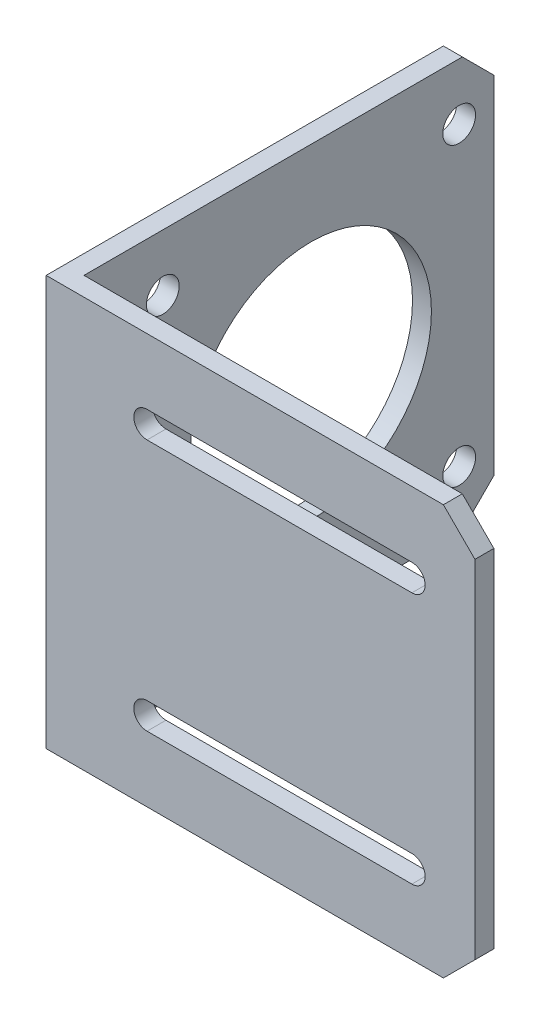
ISO-10303-21;
HEADER;
FILE_DESCRIPTION(('STEP AP214'),'2;1');
FILE_NAME('part.step','',(''),(''),'','','');
FILE_SCHEMA(('AUTOMOTIVE_DESIGN { 1 0 10303 214 1 1 1 1 }'));
ENDSEC;
DATA;
#1=APPLICATION_CONTEXT('core data for automotive mechanical design processes');
#2=APPLICATION_PROTOCOL_DEFINITION('international standard','automotive_design',2000,#1);
#3=PRODUCT_CONTEXT('',#1,'mechanical');
#4=PRODUCT('Part','Part','',(#3));
#5=PRODUCT_RELATED_PRODUCT_CATEGORY('part','',(#4));
#6=PRODUCT_DEFINITION_FORMATION('','',#4);
#7=PRODUCT_DEFINITION_CONTEXT('part definition',#1,'design');
#8=PRODUCT_DEFINITION('design','',#6,#7);
#9=PRODUCT_DEFINITION_SHAPE('','',#8);
#10=(LENGTH_UNIT() NAMED_UNIT(*) SI_UNIT(.MILLI.,.METRE.));
#11=(NAMED_UNIT(*) PLANE_ANGLE_UNIT() SI_UNIT($,.RADIAN.));
#12=(NAMED_UNIT(*) SI_UNIT($,.STERADIAN.) SOLID_ANGLE_UNIT());
#13=UNCERTAINTY_MEASURE_WITH_UNIT(LENGTH_MEASURE(1.E-05),#10,'distance_accuracy_value','');
#14=(GEOMETRIC_REPRESENTATION_CONTEXT(3) GLOBAL_UNCERTAINTY_ASSIGNED_CONTEXT((#13)) GLOBAL_UNIT_ASSIGNED_CONTEXT((#10,
#11,#12)) REPRESENTATION_CONTEXT('',''));
#15=CARTESIAN_POINT('',(0.,0.,0.));
#16=DIRECTION('',(0.,0.,1.));
#17=DIRECTION('',(1.,0.,0.));
#18=AXIS2_PLACEMENT_3D('',#15,#16,#17);
#19=CARTESIAN_POINT('',(0.,65.,0.));
#20=DIRECTION('',(0.,1.,0.));
#21=DIRECTION('',(0.,0.,1.));
#22=AXIS2_PLACEMENT_3D('',#19,#20,#21);
#23=PLANE('',#22);
#24=DIRECTION('',(1.,0.,0.));
#25=VECTOR('',#24,1.);
#26=CARTESIAN_POINT('',(0.,65.,0.));
#27=LINE('',#26,#25);
#28=CARTESIAN_POINT('',(0.,65.,0.));
#29=VERTEX_POINT('',#28);
#30=CARTESIAN_POINT('',(63.,65.,0.));
#31=VERTEX_POINT('',#30);
#32=EDGE_CURVE('E293',#29,#31,#27,.T.);
#33=ORIENTED_EDGE('',*,*,#32,.T.);
#34=DIRECTION('',(0.,0.,-1.));
#35=VECTOR('',#34,1.);
#36=CARTESIAN_POINT('',(63.,65.,-3.));
#37=LINE('',#36,#35);
#38=CARTESIAN_POINT('',(63.,65.,-3.));
#39=VERTEX_POINT('',#38);
#40=EDGE_CURVE('E328',#31,#39,#37,.T.);
#41=ORIENTED_EDGE('',*,*,#40,.T.);
#42=DIRECTION('',(1.,0.,0.));
#43=VECTOR('',#42,1.);
#44=CARTESIAN_POINT('',(0.,65.,-3.));
#45=LINE('',#44,#43);
#46=CARTESIAN_POINT('',(3.,65.,-3.));
#47=VERTEX_POINT('',#46);
#48=EDGE_CURVE('E290',#47,#39,#45,.T.);
#49=ORIENTED_EDGE('',*,*,#48,.F.);
#50=DIRECTION('',(0.,0.,-1.));
#51=VECTOR('',#50,1.);
#52=CARTESIAN_POINT('',(3.,65.,0.));
#53=LINE('',#52,#51);
#54=CARTESIAN_POINT('',(3.,65.,-63.));
#55=VERTEX_POINT('',#54);
#56=EDGE_CURVE('E270',#47,#55,#53,.T.);
#57=ORIENTED_EDGE('',*,*,#56,.T.);
#58=DIRECTION('',(-1.,0.,0.));
#59=VECTOR('',#58,1.);
#60=CARTESIAN_POINT('',(0.,65.,-63.));
#61=LINE('',#60,#59);
#62=CARTESIAN_POINT('',(0.,65.,-63.));
#63=VERTEX_POINT('',#62);
#64=EDGE_CURVE('E326',#55,#63,#61,.T.);
#65=ORIENTED_EDGE('',*,*,#64,.T.);
#66=DIRECTION('',(0.,0.,-1.));
#67=VECTOR('',#66,1.);
#68=CARTESIAN_POINT('',(0.,65.,0.));
#69=LINE('',#68,#67);
#70=EDGE_CURVE('E273',#29,#63,#69,.T.);
#71=ORIENTED_EDGE('',*,*,#70,.F.);
#72=EDGE_LOOP('',(#33,#41,#49,#57,#65,#71));
#73=FACE_BOUND('',#72,.T.);
#74=ADVANCED_FACE('F38',(#73),#23,.T.);
#75=CARTESIAN_POINT('',(0.,65.,-68.));
#76=DIRECTION('',(0.,0.,-1.));
#77=DIRECTION('',(-1.,0.,0.));
#78=AXIS2_PLACEMENT_3D('',#75,#76,#77);
#79=PLANE('',#78);
#80=DIRECTION('',(0.,-1.,0.));
#81=VECTOR('',#80,1.);
#82=CARTESIAN_POINT('',(0.,65.,-68.));
#83=LINE('',#82,#81);
#84=CARTESIAN_POINT('',(0.,60.,-68.));
#85=VERTEX_POINT('',#84);
#86=CARTESIAN_POINT('',(0.,5.00000000000002,-68.));
#87=VERTEX_POINT('',#86);
#88=EDGE_CURVE('E277',#85,#87,#83,.T.);
#89=ORIENTED_EDGE('',*,*,#88,.F.);
#90=DIRECTION('',(1.,0.,0.));
#91=VECTOR('',#90,1.);
#92=CARTESIAN_POINT('',(0.,60.,-68.));
#93=LINE('',#92,#91);
#94=CARTESIAN_POINT('',(3.,60.,-68.));
#95=VERTEX_POINT('',#94);
#96=EDGE_CURVE('E333',#85,#95,#93,.T.);
#97=ORIENTED_EDGE('',*,*,#96,.T.);
#98=DIRECTION('',(0.,-1.,0.));
#99=VECTOR('',#98,1.);
#100=CARTESIAN_POINT('',(3.,65.,-68.));
#101=LINE('',#100,#99);
#102=CARTESIAN_POINT('',(3.,5.00000000000002,-68.));
#103=VERTEX_POINT('',#102);
#104=EDGE_CURVE('E285',#95,#103,#101,.T.);
#105=ORIENTED_EDGE('',*,*,#104,.T.);
#106=DIRECTION('',(-1.,0.,0.));
#107=VECTOR('',#106,1.);
#108=CARTESIAN_POINT('',(0.,5.00000000000002,-68.));
#109=LINE('',#108,#107);
#110=EDGE_CURVE('E331',#103,#87,#109,.T.);
#111=ORIENTED_EDGE('',*,*,#110,.T.);
#112=EDGE_LOOP('',(#89,#97,#105,#111));
#113=FACE_BOUND('',#112,.T.);
#114=ADVANCED_FACE('F349',(#113),#79,.T.);
#115=CARTESIAN_POINT('',(0.,0.,0.));
#116=DIRECTION('',(0.,1.,0.));
#117=DIRECTION('',(0.,0.,1.));
#118=AXIS2_PLACEMENT_3D('',#115,#116,#117);
#119=PLANE('',#118);
#120=DIRECTION('',(1.,0.,0.));
#121=VECTOR('',#120,1.);
#122=CARTESIAN_POINT('',(0.,0.,-3.));
#123=LINE('',#122,#121);
#124=CARTESIAN_POINT('',(3.,0.,-3.));
#125=VERTEX_POINT('',#124);
#126=CARTESIAN_POINT('',(63.,0.,-3.));
#127=VERTEX_POINT('',#126);
#128=EDGE_CURVE('E269',#125,#127,#123,.T.);
#129=ORIENTED_EDGE('',*,*,#128,.T.);
#130=DIRECTION('',(0.,0.,1.));
#131=VECTOR('',#130,1.);
#132=CARTESIAN_POINT('',(63.,0.,0.));
#133=LINE('',#132,#131);
#134=CARTESIAN_POINT('',(63.,0.,0.));
#135=VERTEX_POINT('',#134);
#136=EDGE_CURVE('E320',#127,#135,#133,.T.);
#137=ORIENTED_EDGE('',*,*,#136,.T.);
#138=DIRECTION('',(1.,0.,0.));
#139=VECTOR('',#138,1.);
#140=CARTESIAN_POINT('',(0.,0.,0.));
#141=LINE('',#140,#139);
#142=CARTESIAN_POINT('',(0.,0.,0.));
#143=VERTEX_POINT('',#142);
#144=EDGE_CURVE('E294',#143,#135,#141,.T.);
#145=ORIENTED_EDGE('',*,*,#144,.F.);
#146=DIRECTION('',(0.,0.,-1.));
#147=VECTOR('',#146,1.);
#148=CARTESIAN_POINT('',(0.,0.,0.));
#149=LINE('',#148,#147);
#150=CARTESIAN_POINT('',(0.,0.,-63.));
#151=VERTEX_POINT('',#150);
#152=EDGE_CURVE('E274',#143,#151,#149,.T.);
#153=ORIENTED_EDGE('',*,*,#152,.T.);
#154=DIRECTION('',(1.,0.,0.));
#155=VECTOR('',#154,1.);
#156=CARTESIAN_POINT('',(3.,0.,-63.));
#157=LINE('',#156,#155);
#158=CARTESIAN_POINT('',(3.,0.,-63.));
#159=VERTEX_POINT('',#158);
#160=EDGE_CURVE('E317',#151,#159,#157,.T.);
#161=ORIENTED_EDGE('',*,*,#160,.T.);
#162=DIRECTION('',(0.,0.,-1.));
#163=VECTOR('',#162,1.);
#164=CARTESIAN_POINT('',(3.,0.,0.));
#165=LINE('',#164,#163);
#166=EDGE_CURVE('E278',#125,#159,#165,.T.);
#167=ORIENTED_EDGE('',*,*,#166,.F.);
#168=EDGE_LOOP('',(#129,#137,#145,#153,#161,#167));
#169=FACE_BOUND('',#168,.T.);
#170=ADVANCED_FACE('F346',(#169),#119,.F.);
#171=CARTESIAN_POINT('',(3.,65.,0.));
#172=DIRECTION('',(-1.,0.,0.));
#173=DIRECTION('',(0.,0.,1.));
#174=AXIS2_PLACEMENT_3D('',#171,#172,#173);
#175=PLANE('',#174);
#176=CARTESIAN_POINT('',(3.,8.99999999999999,-15.5));
#177=DIRECTION('',(-1.,0.,0.));
#178=DIRECTION('',(0.,0.,1.));
#179=AXIS2_PLACEMENT_3D('',#176,#177,#178);
#180=CIRCLE('',#179,2.6);
#181=CARTESIAN_POINT('',(3.,8.99999999999999,-12.9));
#182=VERTEX_POINT('',#181);
#183=EDGE_CURVE('E266',#182,#182,#180,.T.);
#184=ORIENTED_EDGE('',*,*,#183,.T.);
#185=EDGE_LOOP('',(#184));
#186=FACE_BOUND('',#185,.T.);
#187=CARTESIAN_POINT('',(3.,56.,-15.5));
#188=DIRECTION('',(-1.,0.,0.));
#189=DIRECTION('',(0.,0.,1.));
#190=AXIS2_PLACEMENT_3D('',#187,#188,#189);
#191=CIRCLE('',#190,2.6);
#192=CARTESIAN_POINT('',(3.,56.,-12.9));
#193=VERTEX_POINT('',#192);
#194=EDGE_CURVE('E263',#193,#193,#191,.T.);
#195=ORIENTED_EDGE('',*,*,#194,.T.);
#196=EDGE_LOOP('',(#195));
#197=FACE_BOUND('',#196,.T.);
#198=CARTESIAN_POINT('',(3.,56.,-62.5));
#199=DIRECTION('',(-1.,0.,0.));
#200=DIRECTION('',(0.,0.,1.));
#201=AXIS2_PLACEMENT_3D('',#198,#199,#200);
#202=CIRCLE('',#201,2.6);
#203=CARTESIAN_POINT('',(3.,56.,-59.9));
#204=VERTEX_POINT('',#203);
#205=EDGE_CURVE('E260',#204,#204,#202,.T.);
#206=ORIENTED_EDGE('',*,*,#205,.T.);
#207=EDGE_LOOP('',(#206));
#208=FACE_BOUND('',#207,.T.);
#209=CARTESIAN_POINT('',(3.,8.99999999999998,-62.5));
#210=DIRECTION('',(-1.,0.,0.));
#211=DIRECTION('',(0.,0.,1.));
#212=AXIS2_PLACEMENT_3D('',#209,#210,#211);
#213=CIRCLE('',#212,2.6);
#214=CARTESIAN_POINT('',(3.,8.99999999999998,-59.9));
#215=VERTEX_POINT('',#214);
#216=EDGE_CURVE('E257',#215,#215,#213,.T.);
#217=ORIENTED_EDGE('',*,*,#216,.T.);
#218=EDGE_LOOP('',(#217));
#219=FACE_BOUND('',#218,.T.);
#220=CARTESIAN_POINT('',(3.,32.5,-39.));
#221=DIRECTION('',(-1.,0.,0.));
#222=DIRECTION('',(0.,0.,1.));
#223=AXIS2_PLACEMENT_3D('',#220,#221,#222);
#224=CIRCLE('',#223,19.1);
#225=CARTESIAN_POINT('',(3.,32.5,-19.9));
#226=VERTEX_POINT('',#225);
#227=EDGE_CURVE('E254',#226,#226,#224,.T.);
#228=ORIENTED_EDGE('',*,*,#227,.T.);
#229=EDGE_LOOP('',(#228));
#230=FACE_BOUND('',#229,.T.);
#231=ORIENTED_EDGE('',*,*,#104,.F.);
#232=DIRECTION('',(0.,-0.707106781186547,-0.707106781186549));
#233=VECTOR('',#232,1.);
#234=CARTESIAN_POINT('',(3.,60.,-68.));
#235=LINE('',#234,#233);
#236=EDGE_CURVE('E61',#95,#55,#235,.F.);
#237=ORIENTED_EDGE('',*,*,#236,.T.);
#238=ORIENTED_EDGE('',*,*,#56,.F.);
#239=DIRECTION('',(0.,-1.,0.));
#240=VECTOR('',#239,1.);
#241=CARTESIAN_POINT('',(3.,65.,-3.));
#242=LINE('',#241,#240);
#243=EDGE_CURVE('E287',#47,#125,#242,.T.);
#244=ORIENTED_EDGE('',*,*,#243,.T.);
#245=ORIENTED_EDGE('',*,*,#166,.T.);
#246=DIRECTION('',(0.,0.707106781186549,-0.707106781186547));
#247=VECTOR('',#246,1.);
#248=CARTESIAN_POINT('',(3.,0.,-63.));
#249=LINE('',#248,#247);
#250=EDGE_CURVE('E53',#159,#103,#249,.T.);
#251=ORIENTED_EDGE('',*,*,#250,.T.);
#252=EDGE_LOOP('',(#231,#237,#238,#244,#245,#251));
#253=FACE_BOUND('',#252,.T.);
#254=ADVANCED_FACE('F350',(#186,#197,#208,#219,#230,#253),#175,.F.);
#255=CARTESIAN_POINT('',(0.,65.,0.));
#256=DIRECTION('',(-1.,0.,0.));
#257=DIRECTION('',(0.,0.,1.));
#258=AXIS2_PLACEMENT_3D('',#255,#256,#257);
#259=PLANE('',#258);
#260=CARTESIAN_POINT('',(0.,8.99999999999999,-15.5));
#261=DIRECTION('',(-1.,0.,0.));
#262=DIRECTION('',(0.,0.,1.));
#263=AXIS2_PLACEMENT_3D('',#260,#261,#262);
#264=CIRCLE('',#263,2.6);
#265=CARTESIAN_POINT('',(0.,8.99999999999999,-12.9));
#266=VERTEX_POINT('',#265);
#267=EDGE_CURVE('E233',#266,#266,#264,.T.);
#268=ORIENTED_EDGE('',*,*,#267,.F.);
#269=EDGE_LOOP('',(#268));
#270=FACE_BOUND('',#269,.T.);
#271=CARTESIAN_POINT('',(0.,56.,-15.5));
#272=DIRECTION('',(-1.,0.,0.));
#273=DIRECTION('',(0.,0.,1.));
#274=AXIS2_PLACEMENT_3D('',#271,#272,#273);
#275=CIRCLE('',#274,2.6);
#276=CARTESIAN_POINT('',(0.,56.,-12.9));
#277=VERTEX_POINT('',#276);
#278=EDGE_CURVE('E247',#277,#277,#275,.T.);
#279=ORIENTED_EDGE('',*,*,#278,.F.);
#280=EDGE_LOOP('',(#279));
#281=FACE_BOUND('',#280,.T.);
#282=CARTESIAN_POINT('',(0.,56.,-62.5));
#283=DIRECTION('',(-1.,0.,0.));
#284=DIRECTION('',(0.,0.,1.));
#285=AXIS2_PLACEMENT_3D('',#282,#283,#284);
#286=CIRCLE('',#285,2.6);
#287=CARTESIAN_POINT('',(0.,56.,-59.9));
#288=VERTEX_POINT('',#287);
#289=EDGE_CURVE('E244',#288,#288,#286,.T.);
#290=ORIENTED_EDGE('',*,*,#289,.F.);
#291=EDGE_LOOP('',(#290));
#292=FACE_BOUND('',#291,.T.);
#293=CARTESIAN_POINT('',(0.,8.99999999999998,-62.5));
#294=DIRECTION('',(-1.,0.,0.));
#295=DIRECTION('',(0.,0.,1.));
#296=AXIS2_PLACEMENT_3D('',#293,#294,#295);
#297=CIRCLE('',#296,2.6);
#298=CARTESIAN_POINT('',(0.,8.99999999999998,-59.9));
#299=VERTEX_POINT('',#298);
#300=EDGE_CURVE('E240',#299,#299,#297,.T.);
#301=ORIENTED_EDGE('',*,*,#300,.F.);
#302=EDGE_LOOP('',(#301));
#303=FACE_BOUND('',#302,.T.);
#304=CARTESIAN_POINT('',(0.,32.5,-39.));
#305=DIRECTION('',(-1.,0.,0.));
#306=DIRECTION('',(0.,0.,1.));
#307=AXIS2_PLACEMENT_3D('',#304,#305,#306);
#308=CIRCLE('',#307,19.1);
#309=CARTESIAN_POINT('',(0.,32.5,-19.9));
#310=VERTEX_POINT('',#309);
#311=EDGE_CURVE('E243',#310,#310,#308,.T.);
#312=ORIENTED_EDGE('',*,*,#311,.F.);
#313=EDGE_LOOP('',(#312));
#314=FACE_BOUND('',#313,.T.);
#315=ORIENTED_EDGE('',*,*,#70,.T.);
#316=DIRECTION('',(0.,0.707106781186547,0.707106781186549));
#317=VECTOR('',#316,1.);
#318=CARTESIAN_POINT('',(0.,96.5,-31.4999999999999));
#319=LINE('',#318,#317);
#320=EDGE_CURVE('E11',#63,#85,#319,.F.);
#321=ORIENTED_EDGE('',*,*,#320,.T.);
#322=ORIENTED_EDGE('',*,*,#88,.T.);
#323=DIRECTION('',(0.,-0.707106781186549,0.707106781186547));
#324=VECTOR('',#323,1.);
#325=CARTESIAN_POINT('',(0.,1.00000000000008,-64.0000000000001));
#326=LINE('',#325,#324);
#327=EDGE_CURVE('E46',#87,#151,#326,.T.);
#328=ORIENTED_EDGE('',*,*,#327,.T.);
#329=ORIENTED_EDGE('',*,*,#152,.F.);
#330=DIRECTION('',(0.,-1.,0.));
#331=VECTOR('',#330,1.);
#332=CARTESIAN_POINT('',(0.,65.,0.));
#333=LINE('',#332,#331);
#334=EDGE_CURVE('E280',#29,#143,#333,.T.);
#335=ORIENTED_EDGE('',*,*,#334,.F.);
#336=EDGE_LOOP('',(#315,#321,#322,#328,#329,#335));
#337=FACE_BOUND('',#336,.T.);
#338=ADVANCED_FACE('F338',(#270,#281,#292,#303,#314,#337),#259,.T.);
#339=CARTESIAN_POINT('',(0.,65.,0.));
#340=DIRECTION('',(0.,0.,-1.));
#341=DIRECTION('',(-1.,0.,0.));
#342=AXIS2_PLACEMENT_3D('',#339,#340,#341);
#343=PLANE('',#342);
#344=DIRECTION('',(1.,0.,0.));
#345=VECTOR('',#344,1.);
#346=CARTESIAN_POINT('',(0.,50.4,0.));
#347=LINE('',#346,#345);
#348=CARTESIAN_POINT('',(16.,50.4,0.));
#349=VERTEX_POINT('',#348);
#350=CARTESIAN_POINT('',(58.,50.4,0.));
#351=VERTEX_POINT('',#350);
#352=EDGE_CURVE('E176',#349,#351,#347,.T.);
#353=ORIENTED_EDGE('',*,*,#352,.F.);
#354=CARTESIAN_POINT('',(16.,52.5,0.));
#355=DIRECTION('',(0.,0.,1.));
#356=DIRECTION('',(-1.,0.,0.));
#357=AXIS2_PLACEMENT_3D('',#354,#355,#356);
#358=CIRCLE('',#357,2.1);
#359=CARTESIAN_POINT('',(16.,54.6,0.));
#360=VERTEX_POINT('',#359);
#361=EDGE_CURVE('E164',#360,#349,#358,.T.);
#362=ORIENTED_EDGE('',*,*,#361,.F.);
#363=DIRECTION('',(-1.,0.,0.));
#364=VECTOR('',#363,1.);
#365=CARTESIAN_POINT('',(0.,54.6,0.));
#366=LINE('',#365,#364);
#367=CARTESIAN_POINT('',(58.,54.6,0.));
#368=VERTEX_POINT('',#367);
#369=EDGE_CURVE('E175',#368,#360,#366,.T.);
#370=ORIENTED_EDGE('',*,*,#369,.F.);
#371=CARTESIAN_POINT('',(58.,52.5,0.));
#372=DIRECTION('',(0.,0.,1.));
#373=DIRECTION('',(-1.,0.,0.));
#374=AXIS2_PLACEMENT_3D('',#371,#372,#373);
#375=CIRCLE('',#374,2.1);
#376=EDGE_CURVE('E184',#351,#368,#375,.T.);
#377=ORIENTED_EDGE('',*,*,#376,.F.);
#378=EDGE_LOOP('',(#353,#362,#370,#377));
#379=FACE_BOUND('',#378,.T.);
#380=CARTESIAN_POINT('',(16.,12.5,0.));
#381=DIRECTION('',(0.,0.,-1.));
#382=DIRECTION('',(-1.,0.,0.));
#383=AXIS2_PLACEMENT_3D('',#380,#381,#382);
#384=CIRCLE('',#383,2.1);
#385=CARTESIAN_POINT('',(16.,10.4,0.));
#386=VERTEX_POINT('',#385);
#387=CARTESIAN_POINT('',(16.,14.6,0.));
#388=VERTEX_POINT('',#387);
#389=EDGE_CURVE('E218',#386,#388,#384,.T.);
#390=ORIENTED_EDGE('',*,*,#389,.T.);
#391=DIRECTION('',(1.,0.,0.));
#392=VECTOR('',#391,1.);
#393=CARTESIAN_POINT('',(0.,14.6,0.));
#394=LINE('',#393,#392);
#395=CARTESIAN_POINT('',(58.,14.6,0.));
#396=VERTEX_POINT('',#395);
#397=EDGE_CURVE('E208',#388,#396,#394,.T.);
#398=ORIENTED_EDGE('',*,*,#397,.T.);
#399=CARTESIAN_POINT('',(58.,12.5,0.));
#400=DIRECTION('',(0.,0.,-1.));
#401=DIRECTION('',(-1.,0.,0.));
#402=AXIS2_PLACEMENT_3D('',#399,#400,#401);
#403=CIRCLE('',#402,2.1);
#404=CARTESIAN_POINT('',(58.,10.4,0.));
#405=VERTEX_POINT('',#404);
#406=EDGE_CURVE('E211',#396,#405,#403,.T.);
#407=ORIENTED_EDGE('',*,*,#406,.T.);
#408=DIRECTION('',(-1.,0.,0.));
#409=VECTOR('',#408,1.);
#410=CARTESIAN_POINT('',(0.,10.4,0.));
#411=LINE('',#410,#409);
#412=EDGE_CURVE('E215',#405,#386,#411,.T.);
#413=ORIENTED_EDGE('',*,*,#412,.T.);
#414=EDGE_LOOP('',(#390,#398,#407,#413));
#415=FACE_BOUND('',#414,.T.);
#416=ORIENTED_EDGE('',*,*,#144,.T.);
#417=DIRECTION('',(-0.707106781186548,-0.707106781186548,0.));
#418=VECTOR('',#417,1.);
#419=CARTESIAN_POINT('',(68.,5.,0.));
#420=LINE('',#419,#418);
#421=CARTESIAN_POINT('',(68.,5.,0.));
#422=VERTEX_POINT('',#421);
#423=EDGE_CURVE('E324',#135,#422,#420,.F.);
#424=ORIENTED_EDGE('',*,*,#423,.T.);
#425=DIRECTION('',(0.,-1.,0.));
#426=VECTOR('',#425,1.);
#427=CARTESIAN_POINT('',(68.,65.,0.));
#428=LINE('',#427,#426);
#429=CARTESIAN_POINT('',(68.,60.,0.));
#430=VERTEX_POINT('',#429);
#431=EDGE_CURVE('E304',#430,#422,#428,.T.);
#432=ORIENTED_EDGE('',*,*,#431,.F.);
#433=DIRECTION('',(-0.707106781186547,0.707106781186548,0.));
#434=VECTOR('',#433,1.);
#435=CARTESIAN_POINT('',(63.,65.,0.));
#436=LINE('',#435,#434);
#437=EDGE_CURVE('E322',#430,#31,#436,.T.);
#438=ORIENTED_EDGE('',*,*,#437,.T.);
#439=ORIENTED_EDGE('',*,*,#32,.F.);
#440=ORIENTED_EDGE('',*,*,#334,.T.);
#441=EDGE_LOOP('',(#416,#424,#432,#438,#439,#440));
#442=FACE_BOUND('',#441,.T.);
#443=ADVANCED_FACE('F187',(#379,#415,#442),#343,.F.);
#444=CARTESIAN_POINT('',(68.,65.,0.));
#445=DIRECTION('',(-1.,0.,0.));
#446=DIRECTION('',(0.,0.,1.));
#447=AXIS2_PLACEMENT_3D('',#444,#445,#446);
#448=PLANE('',#447);
#449=ORIENTED_EDGE('',*,*,#431,.T.);
#450=DIRECTION('',(0.,0.,-1.));
#451=VECTOR('',#450,1.);
#452=CARTESIAN_POINT('',(68.,5.,0.));
#453=LINE('',#452,#451);
#454=CARTESIAN_POINT('',(68.,5.,-3.));
#455=VERTEX_POINT('',#454);
#456=EDGE_CURVE('E310',#422,#455,#453,.T.);
#457=ORIENTED_EDGE('',*,*,#456,.T.);
#458=DIRECTION('',(0.,-1.,0.));
#459=VECTOR('',#458,1.);
#460=CARTESIAN_POINT('',(68.,65.,-3.));
#461=LINE('',#460,#459);
#462=CARTESIAN_POINT('',(68.,60.,-3.));
#463=VERTEX_POINT('',#462);
#464=EDGE_CURVE('E297',#463,#455,#461,.T.);
#465=ORIENTED_EDGE('',*,*,#464,.F.);
#466=DIRECTION('',(0.,0.,1.));
#467=VECTOR('',#466,1.);
#468=CARTESIAN_POINT('',(68.,60.,0.));
#469=LINE('',#468,#467);
#470=EDGE_CURVE('E289',#463,#430,#469,.T.);
#471=ORIENTED_EDGE('',*,*,#470,.T.);
#472=EDGE_LOOP('',(#449,#457,#465,#471));
#473=FACE_BOUND('',#472,.T.);
#474=ADVANCED_FACE('F367',(#473),#448,.F.);
#475=CARTESIAN_POINT('',(0.,65.,-3.));
#476=DIRECTION('',(0.,0.,-1.));
#477=DIRECTION('',(-1.,0.,0.));
#478=AXIS2_PLACEMENT_3D('',#475,#476,#477);
#479=PLANE('',#478);
#480=CARTESIAN_POINT('',(16.,52.5,-3.));
#481=DIRECTION('',(0.,0.,1.));
#482=DIRECTION('',(-1.,0.,0.));
#483=AXIS2_PLACEMENT_3D('',#480,#481,#482);
#484=CIRCLE('',#483,2.1);
#485=CARTESIAN_POINT('',(16.,54.6,-3.));
#486=VERTEX_POINT('',#485);
#487=CARTESIAN_POINT('',(16.,50.4,-3.));
#488=VERTEX_POINT('',#487);
#489=EDGE_CURVE('E198',#486,#488,#484,.T.);
#490=ORIENTED_EDGE('',*,*,#489,.T.);
#491=DIRECTION('',(1.,0.,0.));
#492=VECTOR('',#491,1.);
#493=CARTESIAN_POINT('',(0.,50.4,-3.));
#494=LINE('',#493,#492);
#495=CARTESIAN_POINT('',(58.,50.4,-3.));
#496=VERTEX_POINT('',#495);
#497=EDGE_CURVE('E183',#488,#496,#494,.T.);
#498=ORIENTED_EDGE('',*,*,#497,.T.);
#499=CARTESIAN_POINT('',(58.,52.5,-3.));
#500=DIRECTION('',(0.,0.,1.));
#501=DIRECTION('',(-1.,0.,0.));
#502=AXIS2_PLACEMENT_3D('',#499,#500,#501);
#503=CIRCLE('',#502,2.1);
#504=CARTESIAN_POINT('',(58.,54.6,-3.));
#505=VERTEX_POINT('',#504);
#506=EDGE_CURVE('E189',#496,#505,#503,.T.);
#507=ORIENTED_EDGE('',*,*,#506,.T.);
#508=DIRECTION('',(-1.,0.,0.));
#509=VECTOR('',#508,1.);
#510=CARTESIAN_POINT('',(0.,54.6,-3.));
#511=LINE('',#510,#509);
#512=EDGE_CURVE('E192',#505,#486,#511,.T.);
#513=ORIENTED_EDGE('',*,*,#512,.T.);
#514=EDGE_LOOP('',(#490,#498,#507,#513));
#515=FACE_BOUND('',#514,.T.);
#516=DIRECTION('',(1.,0.,0.));
#517=VECTOR('',#516,1.);
#518=CARTESIAN_POINT('',(0.,14.6,-3.));
#519=LINE('',#518,#517);
#520=CARTESIAN_POINT('',(16.,14.6,-3.));
#521=VERTEX_POINT('',#520);
#522=CARTESIAN_POINT('',(58.,14.6,-3.));
#523=VERTEX_POINT('',#522);
#524=EDGE_CURVE('E204',#521,#523,#519,.T.);
#525=ORIENTED_EDGE('',*,*,#524,.F.);
#526=CARTESIAN_POINT('',(16.,12.5,-3.));
#527=DIRECTION('',(0.,0.,-1.));
#528=DIRECTION('',(-1.,0.,0.));
#529=AXIS2_PLACEMENT_3D('',#526,#527,#528);
#530=CIRCLE('',#529,2.1);
#531=CARTESIAN_POINT('',(16.,10.4,-3.));
#532=VERTEX_POINT('',#531);
#533=EDGE_CURVE('E212',#532,#521,#530,.T.);
#534=ORIENTED_EDGE('',*,*,#533,.F.);
#535=DIRECTION('',(-1.,0.,0.));
#536=VECTOR('',#535,1.);
#537=CARTESIAN_POINT('',(0.,10.4,-3.));
#538=LINE('',#537,#536);
#539=CARTESIAN_POINT('',(58.,10.4,-3.));
#540=VERTEX_POINT('',#539);
#541=EDGE_CURVE('E226',#540,#532,#538,.T.);
#542=ORIENTED_EDGE('',*,*,#541,.F.);
#543=CARTESIAN_POINT('',(58.,12.5,-3.));
#544=DIRECTION('',(0.,0.,-1.));
#545=DIRECTION('',(-1.,0.,0.));
#546=AXIS2_PLACEMENT_3D('',#543,#544,#545);
#547=CIRCLE('',#546,2.1);
#548=EDGE_CURVE('E223',#523,#540,#547,.T.);
#549=ORIENTED_EDGE('',*,*,#548,.F.);
#550=EDGE_LOOP('',(#525,#534,#542,#549));
#551=FACE_BOUND('',#550,.T.);
#552=ORIENTED_EDGE('',*,*,#464,.T.);
#553=DIRECTION('',(0.707106781186548,0.707106781186548,0.));
#554=VECTOR('',#553,1.);
#555=CARTESIAN_POINT('',(64.,1.00000000000001,-3.));
#556=LINE('',#555,#554);
#557=EDGE_CURVE('E315',#455,#127,#556,.F.);
#558=ORIENTED_EDGE('',*,*,#557,.T.);
#559=ORIENTED_EDGE('',*,*,#128,.F.);
#560=ORIENTED_EDGE('',*,*,#243,.F.);
#561=ORIENTED_EDGE('',*,*,#48,.T.);
#562=DIRECTION('',(0.707106781186547,-0.707106781186548,0.));
#563=VECTOR('',#562,1.);
#564=CARTESIAN_POINT('',(31.5,96.5,-3.));
#565=LINE('',#564,#563);
#566=EDGE_CURVE('E313',#39,#463,#565,.T.);
#567=ORIENTED_EDGE('',*,*,#566,.T.);
#568=EDGE_LOOP('',(#552,#558,#559,#560,#561,#567));
#569=FACE_BOUND('',#568,.T.);
#570=ADVANCED_FACE('F365',(#515,#551,#569),#479,.T.);
#571=CARTESIAN_POINT('',(68.,32.5,-39.));
#572=DIRECTION('',(-1.,0.,0.));
#573=DIRECTION('',(0.,0.,1.));
#574=AXIS2_PLACEMENT_3D('',#571,#572,#573);
#575=CYLINDRICAL_SURFACE('',#574,19.1);
#576=ORIENTED_EDGE('',*,*,#311,.T.);
#577=EDGE_LOOP('',(#576));
#578=FACE_BOUND('',#577,.T.);
#579=ORIENTED_EDGE('',*,*,#227,.F.);
#580=EDGE_LOOP('',(#579));
#581=FACE_BOUND('',#580,.T.);
#582=ADVANCED_FACE('F382',(#578,#581),#575,.F.);
#583=CARTESIAN_POINT('',(68.,8.99999999999998,-62.5));
#584=DIRECTION('',(-1.,0.,0.));
#585=DIRECTION('',(0.,0.,1.));
#586=AXIS2_PLACEMENT_3D('',#583,#584,#585);
#587=CYLINDRICAL_SURFACE('',#586,2.6);
#588=ORIENTED_EDGE('',*,*,#300,.T.);
#589=EDGE_LOOP('',(#588));
#590=FACE_BOUND('',#589,.T.);
#591=ORIENTED_EDGE('',*,*,#216,.F.);
#592=EDGE_LOOP('',(#591));
#593=FACE_BOUND('',#592,.T.);
#594=ADVANCED_FACE('F414',(#590,#593),#587,.F.);
#595=CARTESIAN_POINT('',(68.,56.,-62.5));
#596=DIRECTION('',(-1.,0.,0.));
#597=DIRECTION('',(0.,0.,1.));
#598=AXIS2_PLACEMENT_3D('',#595,#596,#597);
#599=CYLINDRICAL_SURFACE('',#598,2.6);
#600=ORIENTED_EDGE('',*,*,#289,.T.);
#601=EDGE_LOOP('',(#600));
#602=FACE_BOUND('',#601,.T.);
#603=ORIENTED_EDGE('',*,*,#205,.F.);
#604=EDGE_LOOP('',(#603));
#605=FACE_BOUND('',#604,.T.);
#606=ADVANCED_FACE('F419',(#602,#605),#599,.F.);
#607=CARTESIAN_POINT('',(68.,56.,-15.5));
#608=DIRECTION('',(-1.,0.,0.));
#609=DIRECTION('',(0.,0.,1.));
#610=AXIS2_PLACEMENT_3D('',#607,#608,#609);
#611=CYLINDRICAL_SURFACE('',#610,2.6);
#612=ORIENTED_EDGE('',*,*,#278,.T.);
#613=EDGE_LOOP('',(#612));
#614=FACE_BOUND('',#613,.T.);
#615=ORIENTED_EDGE('',*,*,#194,.F.);
#616=EDGE_LOOP('',(#615));
#617=FACE_BOUND('',#616,.T.);
#618=ADVANCED_FACE('F427',(#614,#617),#611,.F.);
#619=CARTESIAN_POINT('',(68.,8.99999999999999,-15.5));
#620=DIRECTION('',(-1.,0.,0.));
#621=DIRECTION('',(0.,0.,1.));
#622=AXIS2_PLACEMENT_3D('',#619,#620,#621);
#623=CYLINDRICAL_SURFACE('',#622,2.6);
#624=ORIENTED_EDGE('',*,*,#267,.T.);
#625=EDGE_LOOP('',(#624));
#626=FACE_BOUND('',#625,.T.);
#627=ORIENTED_EDGE('',*,*,#183,.F.);
#628=EDGE_LOOP('',(#627));
#629=FACE_BOUND('',#628,.T.);
#630=ADVANCED_FACE('F436',(#626,#629),#623,.F.);
#631=CARTESIAN_POINT('',(0.,14.6,0.));
#632=DIRECTION('',(0.,1.,0.));
#633=DIRECTION('',(-1.,0.,0.));
#634=AXIS2_PLACEMENT_3D('',#631,#632,#633);
#635=PLANE('',#634);
#636=ORIENTED_EDGE('',*,*,#524,.T.);
#637=DIRECTION('',(0.,0.,-1.));
#638=VECTOR('',#637,1.);
#639=CARTESIAN_POINT('',(58.,14.6,0.));
#640=LINE('',#639,#638);
#641=EDGE_CURVE('E221',#396,#523,#640,.T.);
#642=ORIENTED_EDGE('',*,*,#641,.F.);
#643=ORIENTED_EDGE('',*,*,#397,.F.);
#644=DIRECTION('',(0.,0.,-1.));
#645=VECTOR('',#644,1.);
#646=CARTESIAN_POINT('',(16.,14.6,0.));
#647=LINE('',#646,#645);
#648=EDGE_CURVE('E231',#388,#521,#647,.T.);
#649=ORIENTED_EDGE('',*,*,#648,.T.);
#650=EDGE_LOOP('',(#636,#642,#643,#649));
#651=FACE_BOUND('',#650,.T.);
#652=ADVANCED_FACE('F432',(#651),#635,.F.);
#653=CARTESIAN_POINT('',(16.,12.5,0.));
#654=DIRECTION('',(0.,0.,-1.));
#655=DIRECTION('',(-1.,0.,0.));
#656=AXIS2_PLACEMENT_3D('',#653,#654,#655);
#657=CYLINDRICAL_SURFACE('',#656,2.1);
#658=ORIENTED_EDGE('',*,*,#533,.T.);
#659=ORIENTED_EDGE('',*,*,#648,.F.);
#660=ORIENTED_EDGE('',*,*,#389,.F.);
#661=DIRECTION('',(0.,0.,-1.));
#662=VECTOR('',#661,1.);
#663=CARTESIAN_POINT('',(16.,10.4,0.));
#664=LINE('',#663,#662);
#665=EDGE_CURVE('E234',#386,#532,#664,.T.);
#666=ORIENTED_EDGE('',*,*,#665,.T.);
#667=EDGE_LOOP('',(#658,#659,#660,#666));
#668=FACE_BOUND('',#667,.T.);
#669=ADVANCED_FACE('F443',(#668),#657,.F.);
#670=CARTESIAN_POINT('',(0.,10.4,0.));
#671=DIRECTION('',(0.,-1.,0.));
#672=DIRECTION('',(0.,0.,-1.));
#673=AXIS2_PLACEMENT_3D('',#670,#671,#672);
#674=PLANE('',#673);
#675=ORIENTED_EDGE('',*,*,#541,.T.);
#676=ORIENTED_EDGE('',*,*,#665,.F.);
#677=ORIENTED_EDGE('',*,*,#412,.F.);
#678=DIRECTION('',(0.,0.,-1.));
#679=VECTOR('',#678,1.);
#680=CARTESIAN_POINT('',(58.,10.4,0.));
#681=LINE('',#680,#679);
#682=EDGE_CURVE('E236',#405,#540,#681,.T.);
#683=ORIENTED_EDGE('',*,*,#682,.T.);
#684=EDGE_LOOP('',(#675,#676,#677,#683));
#685=FACE_BOUND('',#684,.T.);
#686=ADVANCED_FACE('F458',(#685),#674,.F.);
#687=CARTESIAN_POINT('',(58.,12.5,0.));
#688=DIRECTION('',(0.,0.,-1.));
#689=DIRECTION('',(-1.,0.,0.));
#690=AXIS2_PLACEMENT_3D('',#687,#688,#689);
#691=CYLINDRICAL_SURFACE('',#690,2.1);
#692=ORIENTED_EDGE('',*,*,#548,.T.);
#693=ORIENTED_EDGE('',*,*,#682,.F.);
#694=ORIENTED_EDGE('',*,*,#406,.F.);
#695=ORIENTED_EDGE('',*,*,#641,.T.);
#696=EDGE_LOOP('',(#692,#693,#694,#695));
#697=FACE_BOUND('',#696,.T.);
#698=ADVANCED_FACE('F468',(#697),#691,.F.);
#699=CARTESIAN_POINT('',(0.,50.4,0.));
#700=DIRECTION('',(0.,1.,0.));
#701=DIRECTION('',(-1.,0.,0.));
#702=AXIS2_PLACEMENT_3D('',#699,#700,#701);
#703=PLANE('',#702);
#704=ORIENTED_EDGE('',*,*,#497,.F.);
#705=DIRECTION('',(0.,0.,-1.));
#706=VECTOR('',#705,1.);
#707=CARTESIAN_POINT('',(16.,50.4,0.));
#708=LINE('',#707,#706);
#709=EDGE_CURVE('E168',#349,#488,#708,.T.);
#710=ORIENTED_EDGE('',*,*,#709,.F.);
#711=ORIENTED_EDGE('',*,*,#352,.T.);
#712=DIRECTION('',(0.,0.,-1.));
#713=VECTOR('',#712,1.);
#714=CARTESIAN_POINT('',(58.,50.4,0.));
#715=LINE('',#714,#713);
#716=EDGE_CURVE('E202',#351,#496,#715,.T.);
#717=ORIENTED_EDGE('',*,*,#716,.T.);
#718=EDGE_LOOP('',(#704,#710,#711,#717));
#719=FACE_BOUND('',#718,.T.);
#720=ADVANCED_FACE('F179',(#719),#703,.T.);
#721=CARTESIAN_POINT('',(58.,52.5,0.));
#722=DIRECTION('',(0.,0.,-1.));
#723=DIRECTION('',(-1.,0.,0.));
#724=AXIS2_PLACEMENT_3D('',#721,#722,#723);
#725=CYLINDRICAL_SURFACE('',#724,2.1);
#726=ORIENTED_EDGE('',*,*,#506,.F.);
#727=ORIENTED_EDGE('',*,*,#716,.F.);
#728=ORIENTED_EDGE('',*,*,#376,.T.);
#729=DIRECTION('',(0.,0.,-1.));
#730=VECTOR('',#729,1.);
#731=CARTESIAN_POINT('',(58.,54.6,0.));
#732=LINE('',#731,#730);
#733=EDGE_CURVE('E205',#368,#505,#732,.T.);
#734=ORIENTED_EDGE('',*,*,#733,.T.);
#735=EDGE_LOOP('',(#726,#727,#728,#734));
#736=FACE_BOUND('',#735,.T.);
#737=ADVANCED_FACE('F481',(#736),#725,.F.);
#738=CARTESIAN_POINT('',(0.,54.6,0.));
#739=DIRECTION('',(0.,-1.,0.));
#740=DIRECTION('',(0.,0.,-1.));
#741=AXIS2_PLACEMENT_3D('',#738,#739,#740);
#742=PLANE('',#741);
#743=ORIENTED_EDGE('',*,*,#512,.F.);
#744=ORIENTED_EDGE('',*,*,#733,.F.);
#745=ORIENTED_EDGE('',*,*,#369,.T.);
#746=DIRECTION('',(0.,0.,-1.));
#747=VECTOR('',#746,1.);
#748=CARTESIAN_POINT('',(16.,54.6,0.));
#749=LINE('',#748,#747);
#750=EDGE_CURVE('E170',#360,#486,#749,.T.);
#751=ORIENTED_EDGE('',*,*,#750,.T.);
#752=EDGE_LOOP('',(#743,#744,#745,#751));
#753=FACE_BOUND('',#752,.T.);
#754=ADVANCED_FACE('F484',(#753),#742,.T.);
#755=CARTESIAN_POINT('',(16.,52.5,0.));
#756=DIRECTION('',(0.,0.,-1.));
#757=DIRECTION('',(-1.,0.,0.));
#758=AXIS2_PLACEMENT_3D('',#755,#756,#757);
#759=CYLINDRICAL_SURFACE('',#758,2.1);
#760=ORIENTED_EDGE('',*,*,#489,.F.);
#761=ORIENTED_EDGE('',*,*,#750,.F.);
#762=ORIENTED_EDGE('',*,*,#361,.T.);
#763=ORIENTED_EDGE('',*,*,#709,.T.);
#764=EDGE_LOOP('',(#760,#761,#762,#763));
#765=FACE_BOUND('',#764,.T.);
#766=ADVANCED_FACE('F167',(#765),#759,.F.);
#767=CARTESIAN_POINT('',(68.,5.,0.));
#768=DIRECTION('',(-0.707106781186547,0.707106781186547,0.));
#769=DIRECTION('',(0.,0.,-1.));
#770=AXIS2_PLACEMENT_3D('',#767,#768,#769);
#771=PLANE('',#770);
#772=ORIENTED_EDGE('',*,*,#423,.F.);
#773=ORIENTED_EDGE('',*,*,#136,.F.);
#774=ORIENTED_EDGE('',*,*,#557,.F.);
#775=ORIENTED_EDGE('',*,*,#456,.F.);
#776=EDGE_LOOP('',(#772,#773,#774,#775));
#777=FACE_BOUND('',#776,.T.);
#778=ADVANCED_FACE('F372',(#777),#771,.F.);
#779=CARTESIAN_POINT('',(63.,65.,0.));
#780=DIRECTION('',(0.707106781186548,0.707106781186547,0.));
#781=DIRECTION('',(0.,0.,1.));
#782=AXIS2_PLACEMENT_3D('',#779,#780,#781);
#783=PLANE('',#782);
#784=ORIENTED_EDGE('',*,*,#437,.F.);
#785=ORIENTED_EDGE('',*,*,#470,.F.);
#786=ORIENTED_EDGE('',*,*,#566,.F.);
#787=ORIENTED_EDGE('',*,*,#40,.F.);
#788=EDGE_LOOP('',(#784,#785,#786,#787));
#789=FACE_BOUND('',#788,.T.);
#790=ADVANCED_FACE('F361',(#789),#783,.T.);
#791=CARTESIAN_POINT('',(0.,60.,-68.));
#792=DIRECTION('',(0.,-0.707106781186549,0.707106781186547));
#793=DIRECTION('',(1.,0.,0.));
#794=AXIS2_PLACEMENT_3D('',#791,#792,#793);
#795=PLANE('',#794);
#796=ORIENTED_EDGE('',*,*,#320,.F.);
#797=ORIENTED_EDGE('',*,*,#64,.F.);
#798=ORIENTED_EDGE('',*,*,#236,.F.);
#799=ORIENTED_EDGE('',*,*,#96,.F.);
#800=EDGE_LOOP('',(#796,#797,#798,#799));
#801=FACE_BOUND('',#800,.T.);
#802=ADVANCED_FACE('F355',(#801),#795,.F.);
#803=CARTESIAN_POINT('',(0.,0.,-63.));
#804=DIRECTION('',(0.,-0.707106781186547,-0.707106781186549));
#805=DIRECTION('',(-1.,0.,0.));
#806=AXIS2_PLACEMENT_3D('',#803,#804,#805);
#807=PLANE('',#806);
#808=ORIENTED_EDGE('',*,*,#327,.F.);
#809=ORIENTED_EDGE('',*,*,#110,.F.);
#810=ORIENTED_EDGE('',*,*,#250,.F.);
#811=ORIENTED_EDGE('',*,*,#160,.F.);
#812=EDGE_LOOP('',(#808,#809,#810,#811));
#813=FACE_BOUND('',#812,.T.);
#814=ADVANCED_FACE('F40',(#813),#807,.T.);
#815=CLOSED_SHELL('',(#74,#114,#170,#254,#338,#443,#474,#570,#582,#594,#606,#618,#630,#652,#669,
#686,#698,#720,#737,#754,#766,#778,#790,#802,#814));
#816=MANIFOLD_SOLID_BREP('B2',#815);
#817=ADVANCED_BREP_SHAPE_REPRESENTATION('',(#18,#816),#14);
#818=SHAPE_DEFINITION_REPRESENTATION(#9,#817);
ENDSEC;
END-ISO-10303-21;
